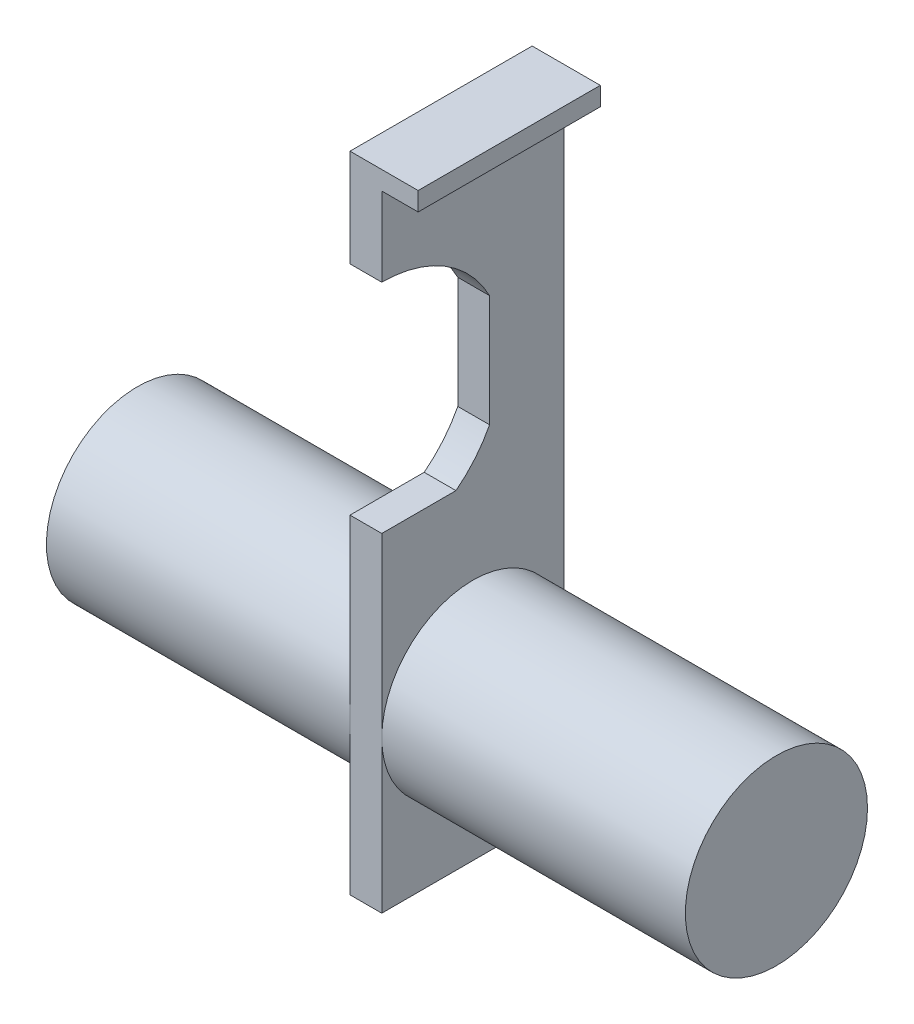
ISO-10303-21;
HEADER;
FILE_DESCRIPTION(('STEP AP214'),'2;1');
FILE_NAME('part.step','',(''),(''),'','','');
FILE_SCHEMA(('AUTOMOTIVE_DESIGN { 1 0 10303 214 1 1 1 1 }'));
ENDSEC;
DATA;
#1=APPLICATION_CONTEXT('core data for automotive mechanical design processes');
#2=APPLICATION_PROTOCOL_DEFINITION('international standard','automotive_design',2000,#1);
#3=PRODUCT_CONTEXT('',#1,'mechanical');
#4=PRODUCT('Part','Part','',(#3));
#5=PRODUCT_RELATED_PRODUCT_CATEGORY('part','',(#4));
#6=PRODUCT_DEFINITION_FORMATION('','',#4);
#7=PRODUCT_DEFINITION_CONTEXT('part definition',#1,'design');
#8=PRODUCT_DEFINITION('design','',#6,#7);
#9=PRODUCT_DEFINITION_SHAPE('','',#8);
#10=(LENGTH_UNIT() NAMED_UNIT(*) SI_UNIT(.MILLI.,.METRE.));
#11=(NAMED_UNIT(*) PLANE_ANGLE_UNIT() SI_UNIT($,.RADIAN.));
#12=(NAMED_UNIT(*) SI_UNIT($,.STERADIAN.) SOLID_ANGLE_UNIT());
#13=UNCERTAINTY_MEASURE_WITH_UNIT(LENGTH_MEASURE(1.E-05),#10,'distance_accuracy_value','');
#14=(GEOMETRIC_REPRESENTATION_CONTEXT(3) GLOBAL_UNCERTAINTY_ASSIGNED_CONTEXT((#13)) GLOBAL_UNIT_ASSIGNED_CONTEXT((#10,
#11,#12)) REPRESENTATION_CONTEXT('',''));
#15=CARTESIAN_POINT('',(0.,0.,0.));
#16=DIRECTION('',(0.,0.,1.));
#17=DIRECTION('',(1.,0.,0.));
#18=AXIS2_PLACEMENT_3D('',#15,#16,#17);
#19=CARTESIAN_POINT('',(0.,-2.59150528660837,7.62));
#20=DIRECTION('',(1.,0.,0.));
#21=DIRECTION('',(0.,1.,0.));
#22=AXIS2_PLACEMENT_3D('',#19,#20,#21);
#23=PLANE('',#22);
#24=CARTESIAN_POINT('',(0.,-19.1015052866084,3.81));
#25=DIRECTION('',(-1.,0.,0.));
#26=DIRECTION('',(0.,-1.,0.));
#27=AXIS2_PLACEMENT_3D('',#24,#25,#26);
#28=CIRCLE('',#27,3.81);
#29=CARTESIAN_POINT('',(0.,-19.1015052866084,7.62));
#30=VERTEX_POINT('',#29);
#31=CARTESIAN_POINT('',(0.,-19.1015052866084,0.));
#32=VERTEX_POINT('',#31);
#33=EDGE_CURVE('E50',#30,#32,#28,.T.);
#34=ORIENTED_EDGE('',*,*,#33,.F.);
#35=DIRECTION('',(0.,-1.,0.));
#36=VECTOR('',#35,1.);
#37=CARTESIAN_POINT('',(0.,1.49263776173654,7.62));
#38=LINE('',#37,#36);
#39=CARTESIAN_POINT('',(0.,-11.6930209069824,7.62));
#40=VERTEX_POINT('',#39);
#41=EDGE_CURVE('E137',#40,#30,#38,.T.);
#42=ORIENTED_EDGE('',*,*,#41,.F.);
#43=DIRECTION('',(0.,0.,-1.));
#44=VECTOR('',#43,1.);
#45=CARTESIAN_POINT('',(0.,-11.6930209069824,7.62));
#46=LINE('',#45,#44);
#47=CARTESIAN_POINT('',(0.,-11.6930209069824,4.51616171247803));
#48=VERTEX_POINT('',#47);
#49=EDGE_CURVE('E284',#40,#48,#46,.T.);
#50=ORIENTED_EDGE('',*,*,#49,.T.);
#51=CARTESIAN_POINT('',(0.,-7.67150528660837,7.62));
#52=DIRECTION('',(1.,0.,0.));
#53=DIRECTION('',(0.,1.,0.));
#54=AXIS2_PLACEMENT_3D('',#51,#52,#53);
#55=CIRCLE('',#54,5.08);
#56=CARTESIAN_POINT('',(0.,-10.0108692751987,3.11070114886065));
#57=VERTEX_POINT('',#56);
#58=EDGE_CURVE('E256',#48,#57,#55,.T.);
#59=ORIENTED_EDGE('',*,*,#58,.T.);
#60=DIRECTION('',(0.,1.,0.));
#61=VECTOR('',#60,1.);
#62=CARTESIAN_POINT('',(0.,-2.59150528660837,3.11070114886065));
#63=LINE('',#62,#61);
#64=CARTESIAN_POINT('',(0.,-5.33214129801802,3.11070114886065));
#65=VERTEX_POINT('',#64);
#66=EDGE_CURVE('E43',#57,#65,#63,.T.);
#67=ORIENTED_EDGE('',*,*,#66,.T.);
#68=CARTESIAN_POINT('',(0.,-7.67150528660837,7.62));
#69=DIRECTION('',(1.,0.,0.));
#70=DIRECTION('',(0.,1.,0.));
#71=AXIS2_PLACEMENT_3D('',#68,#69,#70);
#72=CIRCLE('',#71,5.08);
#73=CARTESIAN_POINT('',(0.,-2.59150528660837,7.62));
#74=VERTEX_POINT('',#73);
#75=EDGE_CURVE('E263',#65,#74,#72,.T.);
#76=ORIENTED_EDGE('',*,*,#75,.T.);
#77=CARTESIAN_POINT('',(0.,1.49263776173654,7.62));
#78=VERTEX_POINT('',#77);
#79=EDGE_CURVE('E148',#78,#74,#38,.T.);
#80=ORIENTED_EDGE('',*,*,#79,.F.);
#81=DIRECTION('',(0.,0.,-1.));
#82=VECTOR('',#81,1.);
#83=CARTESIAN_POINT('',(0.,1.49263776173654,7.62));
#84=LINE('',#83,#82);
#85=CARTESIAN_POINT('',(0.,1.49263776173654,0.));
#86=VERTEX_POINT('',#85);
#87=EDGE_CURVE('E245',#78,#86,#84,.T.);
#88=ORIENTED_EDGE('',*,*,#87,.T.);
#89=DIRECTION('',(0.,-1.,0.));
#90=VECTOR('',#89,1.);
#91=CARTESIAN_POINT('',(0.,-2.59150528660837,0.));
#92=LINE('',#91,#90);
#93=EDGE_CURVE('E159',#86,#32,#92,.T.);
#94=ORIENTED_EDGE('',*,*,#93,.T.);
#95=EDGE_LOOP('',(#34,#42,#50,#59,#67,#76,#80,#88,#94));
#96=FACE_BOUND('',#95,.T.);
#97=ADVANCED_FACE('F39',(#96),#23,.F.);
#98=CARTESIAN_POINT('',(1.32900114555892,-2.59150528660837,7.62));
#99=DIRECTION('',(-1.,0.,0.));
#100=DIRECTION('',(0.,0.,1.));
#101=AXIS2_PLACEMENT_3D('',#98,#99,#100);
#102=PLANE('',#101);
#103=CARTESIAN_POINT('',(1.32900114555892,-19.1015052866084,3.81));
#104=DIRECTION('',(1.,0.,0.));
#105=DIRECTION('',(0.,0.,-1.));
#106=AXIS2_PLACEMENT_3D('',#103,#104,#105);
#107=CIRCLE('',#106,3.81);
#108=CARTESIAN_POINT('',(1.32900114555892,-19.1015052866084,7.62));
#109=VERTEX_POINT('',#108);
#110=CARTESIAN_POINT('',(1.32900114555892,-19.1015052866084,0.));
#111=VERTEX_POINT('',#110);
#112=EDGE_CURVE('E376',#109,#111,#107,.T.);
#113=ORIENTED_EDGE('',*,*,#112,.F.);
#114=DIRECTION('',(0.,1.,0.));
#115=VECTOR('',#114,1.);
#116=CARTESIAN_POINT('',(1.32900114555892,-12.7515052866084,7.62));
#117=LINE('',#116,#115);
#118=CARTESIAN_POINT('',(1.32900114555892,-25.4515052866084,7.62));
#119=VERTEX_POINT('',#118);
#120=EDGE_CURVE('E295',#119,#109,#117,.T.);
#121=ORIENTED_EDGE('',*,*,#120,.F.);
#122=DIRECTION('',(0.,0.,1.));
#123=VECTOR('',#122,1.);
#124=CARTESIAN_POINT('',(1.32900114555892,-25.4515052866084,0.));
#125=LINE('',#124,#123);
#126=CARTESIAN_POINT('',(1.32900114555892,-25.4515052866084,0.));
#127=VERTEX_POINT('',#126);
#128=EDGE_CURVE('E319',#127,#119,#125,.T.);
#129=ORIENTED_EDGE('',*,*,#128,.F.);
#130=DIRECTION('',(0.,1.,0.));
#131=VECTOR('',#130,1.);
#132=CARTESIAN_POINT('',(1.32900114555892,-2.59150528660837,0.));
#133=LINE('',#132,#131);
#134=EDGE_CURVE('E225',#127,#111,#133,.T.);
#135=ORIENTED_EDGE('',*,*,#134,.T.);
#136=EDGE_LOOP('',(#113,#121,#129,#135));
#137=FACE_BOUND('',#136,.T.);
#138=ADVANCED_FACE('F180',(#137),#102,.F.);
#139=CARTESIAN_POINT('',(0.,0.,7.62));
#140=DIRECTION('',(0.,0.,1.));
#141=DIRECTION('',(1.,0.,0.));
#142=AXIS2_PLACEMENT_3D('',#139,#140,#141);
#143=PLANE('',#142);
#144=DIRECTION('',(1.,0.,0.));
#145=VECTOR('',#144,1.);
#146=CARTESIAN_POINT('',(-5.02099885444108,-2.59150528660837,7.62));
#147=LINE('',#146,#145);
#148=CARTESIAN_POINT('',(1.32900114555892,-2.59150528660837,7.62));
#149=VERTEX_POINT('',#148);
#150=EDGE_CURVE('E254',#149,#74,#147,.F.);
#151=ORIENTED_EDGE('',*,*,#150,.F.);
#152=CARTESIAN_POINT('',(1.32900114555892,0.714117771054303,7.62));
#153=VERTEX_POINT('',#152);
#154=EDGE_CURVE('E244',#149,#153,#117,.T.);
#155=ORIENTED_EDGE('',*,*,#154,.T.);
#156=DIRECTION('',(1.,0.,0.));
#157=VECTOR('',#156,1.);
#158=CARTESIAN_POINT('',(2.85065385461965,0.714117771054303,7.62));
#159=LINE('',#158,#157);
#160=CARTESIAN_POINT('',(2.85065385461965,0.714117771054303,7.62));
#161=VERTEX_POINT('',#160);
#162=EDGE_CURVE('E298',#153,#161,#159,.T.);
#163=ORIENTED_EDGE('',*,*,#162,.T.);
#164=DIRECTION('',(0.,1.,0.));
#165=VECTOR('',#164,1.);
#166=CARTESIAN_POINT('',(2.85065385461965,1.49263776173654,7.62));
#167=LINE('',#166,#165);
#168=CARTESIAN_POINT('',(2.85065385461965,1.49263776173654,7.62));
#169=VERTEX_POINT('',#168);
#170=EDGE_CURVE('E230',#161,#169,#167,.T.);
#171=ORIENTED_EDGE('',*,*,#170,.T.);
#172=DIRECTION('',(-1.,0.,0.));
#173=VECTOR('',#172,1.);
#174=CARTESIAN_POINT('',(1.32900114555892,1.49263776173654,7.62));
#175=LINE('',#174,#173);
#176=EDGE_CURVE('E155',#169,#78,#175,.T.);
#177=ORIENTED_EDGE('',*,*,#176,.T.);
#178=ORIENTED_EDGE('',*,*,#79,.T.);
#179=EDGE_LOOP('',(#151,#155,#163,#171,#177,#178));
#180=FACE_BOUND('',#179,.T.);
#181=ADVANCED_FACE('F185',(#180),#143,.T.);
#182=EDGE_CURVE('E63',#111,#109,#107,.T.);
#183=ORIENTED_EDGE('',*,*,#182,.F.);
#184=CARTESIAN_POINT('',(1.32900114555892,0.714117771054303,0.));
#185=VERTEX_POINT('',#184);
#186=EDGE_CURVE('E294',#111,#185,#133,.T.);
#187=ORIENTED_EDGE('',*,*,#186,.T.);
#188=DIRECTION('',(0.,0.,-1.));
#189=VECTOR('',#188,1.);
#190=CARTESIAN_POINT('',(1.32900114555892,0.714117771054303,7.62));
#191=LINE('',#190,#189);
#192=EDGE_CURVE('E220',#153,#185,#191,.T.);
#193=ORIENTED_EDGE('',*,*,#192,.F.);
#194=ORIENTED_EDGE('',*,*,#154,.F.);
#195=CARTESIAN_POINT('',(1.32900114555892,-7.67150528660837,7.62));
#196=DIRECTION('',(1.,0.,0.));
#197=DIRECTION('',(0.,0.,-1.));
#198=AXIS2_PLACEMENT_3D('',#195,#196,#197);
#199=CIRCLE('',#198,5.08);
#200=CARTESIAN_POINT('',(1.32900114555892,-5.33214129801802,3.11070114886065));
#201=VERTEX_POINT('',#200);
#202=EDGE_CURVE('E326',#201,#149,#199,.T.);
#203=ORIENTED_EDGE('',*,*,#202,.F.);
#204=DIRECTION('',(0.,1.,0.));
#205=VECTOR('',#204,1.);
#206=CARTESIAN_POINT('',(1.32900114555892,-5.33214129801802,3.11070114886065));
#207=LINE('',#206,#205);
#208=CARTESIAN_POINT('',(1.32900114555892,-10.0108692751987,3.11070114886065));
#209=VERTEX_POINT('',#208);
#210=EDGE_CURVE('E286',#209,#201,#207,.T.);
#211=ORIENTED_EDGE('',*,*,#210,.F.);
#212=CARTESIAN_POINT('',(1.32900114555892,-7.67150528660837,7.62));
#213=DIRECTION('',(1.,0.,0.));
#214=DIRECTION('',(0.,0.,-1.));
#215=AXIS2_PLACEMENT_3D('',#212,#213,#214);
#216=CIRCLE('',#215,5.08);
#217=CARTESIAN_POINT('',(1.32900114555892,-11.6930209069824,4.51616171247803));
#218=VERTEX_POINT('',#217);
#219=EDGE_CURVE('E277',#218,#209,#216,.T.);
#220=ORIENTED_EDGE('',*,*,#219,.F.);
#221=DIRECTION('',(0.,0.,-1.));
#222=VECTOR('',#221,1.);
#223=CARTESIAN_POINT('',(1.32900114555892,-11.6930209069824,7.62));
#224=LINE('',#223,#222);
#225=CARTESIAN_POINT('',(1.32900114555892,-11.6930209069824,7.62));
#226=VERTEX_POINT('',#225);
#227=EDGE_CURVE('E332',#226,#218,#224,.T.);
#228=ORIENTED_EDGE('',*,*,#227,.F.);
#229=EDGE_CURVE('E299',#109,#226,#117,.T.);
#230=ORIENTED_EDGE('',*,*,#229,.F.);
#231=EDGE_LOOP('',(#183,#187,#193,#194,#203,#211,#220,#228,#230));
#232=FACE_BOUND('',#231,.T.);
#233=ADVANCED_FACE('F41',(#232),#102,.F.);
#234=CARTESIAN_POINT('',(2.85065385461965,0.714117771054303,7.62));
#235=DIRECTION('',(0.,1.,0.));
#236=DIRECTION('',(-1.,0.,0.));
#237=AXIS2_PLACEMENT_3D('',#234,#235,#236);
#238=PLANE('',#237);
#239=DIRECTION('',(1.,0.,0.));
#240=VECTOR('',#239,1.);
#241=CARTESIAN_POINT('',(2.85065385461965,0.714117771054303,0.));
#242=LINE('',#241,#240);
#243=CARTESIAN_POINT('',(2.85065385461965,0.714117771054303,0.));
#244=VERTEX_POINT('',#243);
#245=EDGE_CURVE('E214',#185,#244,#242,.T.);
#246=ORIENTED_EDGE('',*,*,#245,.T.);
#247=DIRECTION('',(0.,0.,-1.));
#248=VECTOR('',#247,1.);
#249=CARTESIAN_POINT('',(2.85065385461965,0.714117771054303,7.62));
#250=LINE('',#249,#248);
#251=EDGE_CURVE('E217',#161,#244,#250,.T.);
#252=ORIENTED_EDGE('',*,*,#251,.F.);
#253=ORIENTED_EDGE('',*,*,#162,.F.);
#254=ORIENTED_EDGE('',*,*,#192,.T.);
#255=EDGE_LOOP('',(#246,#252,#253,#254));
#256=FACE_BOUND('',#255,.T.);
#257=ADVANCED_FACE('F202',(#256),#238,.F.);
#258=CARTESIAN_POINT('',(2.85065385461965,1.49263776173654,7.62));
#259=DIRECTION('',(-1.,0.,0.));
#260=DIRECTION('',(0.,0.,1.));
#261=AXIS2_PLACEMENT_3D('',#258,#259,#260);
#262=PLANE('',#261);
#263=DIRECTION('',(0.,1.,0.));
#264=VECTOR('',#263,1.);
#265=CARTESIAN_POINT('',(2.85065385461965,1.49263776173654,0.));
#266=LINE('',#265,#264);
#267=CARTESIAN_POINT('',(2.85065385461965,1.49263776173654,0.));
#268=VERTEX_POINT('',#267);
#269=EDGE_CURVE('E224',#244,#268,#266,.T.);
#270=ORIENTED_EDGE('',*,*,#269,.T.);
#271=DIRECTION('',(0.,0.,-1.));
#272=VECTOR('',#271,1.);
#273=CARTESIAN_POINT('',(2.85065385461965,1.49263776173654,7.62));
#274=LINE('',#273,#272);
#275=EDGE_CURVE('E232',#169,#268,#274,.T.);
#276=ORIENTED_EDGE('',*,*,#275,.F.);
#277=ORIENTED_EDGE('',*,*,#170,.F.);
#278=ORIENTED_EDGE('',*,*,#251,.T.);
#279=EDGE_LOOP('',(#270,#276,#277,#278));
#280=FACE_BOUND('',#279,.T.);
#281=ADVANCED_FACE('F197',(#280),#262,.F.);
#282=CARTESIAN_POINT('',(1.32900114555892,1.49263776173654,7.62));
#283=DIRECTION('',(0.,-1.,0.));
#284=DIRECTION('',(0.,0.,-1.));
#285=AXIS2_PLACEMENT_3D('',#282,#283,#284);
#286=PLANE('',#285);
#287=DIRECTION('',(-1.,0.,0.));
#288=VECTOR('',#287,1.);
#289=CARTESIAN_POINT('',(1.32900114555892,1.49263776173654,0.));
#290=LINE('',#289,#288);
#291=EDGE_CURVE('E234',#268,#86,#290,.T.);
#292=ORIENTED_EDGE('',*,*,#291,.T.);
#293=ORIENTED_EDGE('',*,*,#87,.F.);
#294=ORIENTED_EDGE('',*,*,#176,.F.);
#295=ORIENTED_EDGE('',*,*,#275,.T.);
#296=EDGE_LOOP('',(#292,#293,#294,#295));
#297=FACE_BOUND('',#296,.T.);
#298=ADVANCED_FACE('F190',(#297),#286,.F.);
#299=EDGE_CURVE('E11',#32,#30,#28,.T.);
#300=ORIENTED_EDGE('',*,*,#299,.F.);
#301=CARTESIAN_POINT('',(0.,-25.4515052866084,0.));
#302=VERTEX_POINT('',#301);
#303=EDGE_CURVE('E238',#32,#302,#92,.T.);
#304=ORIENTED_EDGE('',*,*,#303,.T.);
#305=DIRECTION('',(0.,0.,-1.));
#306=VECTOR('',#305,1.);
#307=CARTESIAN_POINT('',(0.,-25.4515052866084,7.62));
#308=LINE('',#307,#306);
#309=CARTESIAN_POINT('',(0.,-25.4515052866084,7.62));
#310=VERTEX_POINT('',#309);
#311=EDGE_CURVE('E153',#310,#302,#308,.T.);
#312=ORIENTED_EDGE('',*,*,#311,.F.);
#313=EDGE_CURVE('E140',#30,#310,#38,.T.);
#314=ORIENTED_EDGE('',*,*,#313,.F.);
#315=EDGE_LOOP('',(#300,#304,#312,#314));
#316=FACE_BOUND('',#315,.T.);
#317=ADVANCED_FACE('F151',(#316),#23,.F.);
#318=DIRECTION('',(1.,0.,0.));
#319=VECTOR('',#318,1.);
#320=CARTESIAN_POINT('',(0.,-11.6930209069824,7.62));
#321=LINE('',#320,#319);
#322=EDGE_CURVE('E143',#40,#226,#321,.T.);
#323=ORIENTED_EDGE('',*,*,#322,.F.);
#324=ORIENTED_EDGE('',*,*,#41,.T.);
#325=ORIENTED_EDGE('',*,*,#313,.T.);
#326=DIRECTION('',(-1.,0.,0.));
#327=VECTOR('',#326,1.);
#328=CARTESIAN_POINT('',(1.32900114555892,-25.4515052866084,7.62));
#329=LINE('',#328,#327);
#330=EDGE_CURVE('E323',#119,#310,#329,.T.);
#331=ORIENTED_EDGE('',*,*,#330,.F.);
#332=ORIENTED_EDGE('',*,*,#120,.T.);
#333=ORIENTED_EDGE('',*,*,#229,.T.);
#334=EDGE_LOOP('',(#323,#324,#325,#331,#332,#333));
#335=FACE_BOUND('',#334,.T.);
#336=ADVANCED_FACE('F138',(#335),#143,.T.);
#337=CARTESIAN_POINT('',(0.,0.,0.));
#338=DIRECTION('',(0.,0.,1.));
#339=DIRECTION('',(1.,0.,0.));
#340=AXIS2_PLACEMENT_3D('',#337,#338,#339);
#341=PLANE('',#340);
#342=ORIENTED_EDGE('',*,*,#134,.F.);
#343=DIRECTION('',(1.,0.,0.));
#344=VECTOR('',#343,1.);
#345=CARTESIAN_POINT('',(0.,-25.4515052866084,0.));
#346=LINE('',#345,#344);
#347=EDGE_CURVE('E315',#302,#127,#346,.T.);
#348=ORIENTED_EDGE('',*,*,#347,.F.);
#349=ORIENTED_EDGE('',*,*,#303,.F.);
#350=ORIENTED_EDGE('',*,*,#93,.F.);
#351=ORIENTED_EDGE('',*,*,#291,.F.);
#352=ORIENTED_EDGE('',*,*,#269,.F.);
#353=ORIENTED_EDGE('',*,*,#245,.F.);
#354=ORIENTED_EDGE('',*,*,#186,.F.);
#355=EDGE_LOOP('',(#342,#348,#349,#350,#351,#352,#353,#354));
#356=FACE_BOUND('',#355,.T.);
#357=ADVANCED_FACE('F195',(#356),#341,.F.);
#358=CARTESIAN_POINT('',(-5.02099885444108,-5.33214129801802,3.11070114886065));
#359=DIRECTION('',(0.,0.,-1.));
#360=DIRECTION('',(0.,1.,0.));
#361=AXIS2_PLACEMENT_3D('',#358,#359,#360);
#362=PLANE('',#361);
#363=DIRECTION('',(1.,0.,0.));
#364=VECTOR('',#363,1.);
#365=CARTESIAN_POINT('',(-5.02099885444108,-10.0108692751987,3.11070114886065));
#366=LINE('',#365,#364);
#367=EDGE_CURVE('E270',#57,#209,#366,.T.);
#368=ORIENTED_EDGE('',*,*,#367,.T.);
#369=ORIENTED_EDGE('',*,*,#210,.T.);
#370=DIRECTION('',(1.,0.,0.));
#371=VECTOR('',#370,1.);
#372=CARTESIAN_POINT('',(-5.02099885444108,-5.33214129801802,3.11070114886065));
#373=LINE('',#372,#371);
#374=EDGE_CURVE('E272',#65,#201,#373,.T.);
#375=ORIENTED_EDGE('',*,*,#374,.F.);
#376=ORIENTED_EDGE('',*,*,#66,.F.);
#377=EDGE_LOOP('',(#368,#369,#375,#376));
#378=FACE_BOUND('',#377,.T.);
#379=ADVANCED_FACE('F268',(#378),#362,.F.);
#380=CARTESIAN_POINT('',(-5.02099885444108,-7.67150528660837,7.62));
#381=DIRECTION('',(1.,0.,0.));
#382=DIRECTION('',(0.,0.,-1.));
#383=AXIS2_PLACEMENT_3D('',#380,#381,#382);
#384=CYLINDRICAL_SURFACE('',#383,5.08);
#385=DIRECTION('',(1.,0.,0.));
#386=VECTOR('',#385,1.);
#387=CARTESIAN_POINT('',(-5.02099885444108,-11.6930209069824,4.51616171247803));
#388=LINE('',#387,#386);
#389=EDGE_CURVE('E280',#48,#218,#388,.T.);
#390=ORIENTED_EDGE('',*,*,#389,.T.);
#391=ORIENTED_EDGE('',*,*,#219,.T.);
#392=ORIENTED_EDGE('',*,*,#367,.F.);
#393=ORIENTED_EDGE('',*,*,#58,.F.);
#394=EDGE_LOOP('',(#390,#391,#392,#393));
#395=FACE_BOUND('',#394,.T.);
#396=ADVANCED_FACE('F274',(#395),#384,.F.);
#397=CARTESIAN_POINT('',(-5.02099885444108,-7.67150528660837,7.62));
#398=DIRECTION('',(1.,0.,0.));
#399=DIRECTION('',(0.,0.,-1.));
#400=AXIS2_PLACEMENT_3D('',#397,#398,#399);
#401=CYLINDRICAL_SURFACE('',#400,5.08);
#402=ORIENTED_EDGE('',*,*,#374,.T.);
#403=ORIENTED_EDGE('',*,*,#202,.T.);
#404=ORIENTED_EDGE('',*,*,#150,.T.);
#405=ORIENTED_EDGE('',*,*,#75,.F.);
#406=EDGE_LOOP('',(#402,#403,#404,#405));
#407=FACE_BOUND('',#406,.T.);
#408=ADVANCED_FACE('F341',(#407),#401,.F.);
#409=CARTESIAN_POINT('',(-5.02099885444108,-11.6930209069824,7.62));
#410=DIRECTION('',(0.,-1.,0.));
#411=DIRECTION('',(0.,0.,-1.));
#412=AXIS2_PLACEMENT_3D('',#409,#410,#411);
#413=PLANE('',#412);
#414=ORIENTED_EDGE('',*,*,#322,.T.);
#415=ORIENTED_EDGE('',*,*,#227,.T.);
#416=ORIENTED_EDGE('',*,*,#389,.F.);
#417=ORIENTED_EDGE('',*,*,#49,.F.);
#418=EDGE_LOOP('',(#414,#415,#416,#417));
#419=FACE_BOUND('',#418,.T.);
#420=ADVANCED_FACE('F349',(#419),#413,.F.);
#421=CARTESIAN_POINT('',(0.,-25.4515052866084,0.));
#422=DIRECTION('',(0.,-1.,0.));
#423=DIRECTION('',(0.,0.,-1.));
#424=AXIS2_PLACEMENT_3D('',#421,#422,#423);
#425=PLANE('',#424);
#426=ORIENTED_EDGE('',*,*,#311,.T.);
#427=ORIENTED_EDGE('',*,*,#347,.T.);
#428=ORIENTED_EDGE('',*,*,#128,.T.);
#429=ORIENTED_EDGE('',*,*,#330,.T.);
#430=EDGE_LOOP('',(#426,#427,#428,#429));
#431=FACE_BOUND('',#430,.T.);
#432=ADVANCED_FACE('F318',(#431),#425,.T.);
#433=CARTESIAN_POINT('',(14.0290011455589,-19.1015052866084,3.81));
#434=DIRECTION('',(-1.,0.,0.));
#435=DIRECTION('',(0.,0.,1.));
#436=AXIS2_PLACEMENT_3D('',#433,#434,#435);
#437=CYLINDRICAL_SURFACE('',#436,3.81);
#438=CARTESIAN_POINT('',(14.0290011455589,-19.1015052866084,3.81));
#439=DIRECTION('',(1.,0.,0.));
#440=DIRECTION('',(0.,0.,-1.));
#441=AXIS2_PLACEMENT_3D('',#438,#439,#440);
#442=CIRCLE('',#441,3.81);
#443=CARTESIAN_POINT('',(14.0290011455589,-19.1015052866084,0.));
#444=VERTEX_POINT('',#443);
#445=EDGE_CURVE('E375',#444,#444,#442,.T.);
#446=ORIENTED_EDGE('',*,*,#445,.F.);
#447=EDGE_LOOP('',(#446));
#448=FACE_BOUND('',#447,.T.);
#449=ORIENTED_EDGE('',*,*,#182,.T.);
#450=ORIENTED_EDGE('',*,*,#112,.T.);
#451=EDGE_LOOP('',(#449,#450));
#452=FACE_BOUND('',#451,.T.);
#453=ADVANCED_FACE('F175',(#448,#452),#437,.T.);
#454=CARTESIAN_POINT('',(14.0290011455589,-19.1015052866084,3.81));
#455=DIRECTION('',(1.,0.,0.));
#456=DIRECTION('',(0.,0.,-1.));
#457=AXIS2_PLACEMENT_3D('',#454,#455,#456);
#458=PLANE('',#457);
#459=ORIENTED_EDGE('',*,*,#445,.T.);
#460=EDGE_LOOP('',(#459));
#461=FACE_BOUND('',#460,.T.);
#462=ADVANCED_FACE('F166',(#461),#458,.T.);
#463=CARTESIAN_POINT('',(-12.7,-19.1015052866084,3.81));
#464=DIRECTION('',(1.,0.,0.));
#465=DIRECTION('',(0.,1.,0.));
#466=AXIS2_PLACEMENT_3D('',#463,#464,#465);
#467=CYLINDRICAL_SURFACE('',#466,3.81);
#468=CARTESIAN_POINT('',(-12.7,-19.1015052866084,3.81));
#469=DIRECTION('',(-1.,0.,0.));
#470=DIRECTION('',(0.,-1.,0.));
#471=AXIS2_PLACEMENT_3D('',#468,#469,#470);
#472=CIRCLE('',#471,3.81);
#473=CARTESIAN_POINT('',(-12.7,-22.9115052866084,3.81));
#474=VERTEX_POINT('',#473);
#475=EDGE_CURVE('E162',#474,#474,#472,.T.);
#476=ORIENTED_EDGE('',*,*,#475,.F.);
#477=EDGE_LOOP('',(#476));
#478=FACE_BOUND('',#477,.T.);
#479=ORIENTED_EDGE('',*,*,#33,.T.);
#480=ORIENTED_EDGE('',*,*,#299,.T.);
#481=EDGE_LOOP('',(#479,#480));
#482=FACE_BOUND('',#481,.T.);
#483=ADVANCED_FACE('F163',(#478,#482),#467,.T.);
#484=CARTESIAN_POINT('',(-12.7,-19.1015052866084,3.81));
#485=DIRECTION('',(-1.,0.,0.));
#486=DIRECTION('',(0.,-1.,0.));
#487=AXIS2_PLACEMENT_3D('',#484,#485,#486);
#488=PLANE('',#487);
#489=ORIENTED_EDGE('',*,*,#475,.T.);
#490=EDGE_LOOP('',(#489));
#491=FACE_BOUND('',#490,.T.);
#492=ADVANCED_FACE('F165',(#491),#488,.T.);
#493=CLOSED_SHELL('',(#97,#138,#181,#233,#257,#281,#298,#317,#336,#357,#379,#396,#408,#420,#432,
#453,#462,#483,#492));
#494=MANIFOLD_SOLID_BREP('B2',#493);
#495=ADVANCED_BREP_SHAPE_REPRESENTATION('',(#18,#494),#14);
#496=SHAPE_DEFINITION_REPRESENTATION(#9,#495);
ENDSEC;
END-ISO-10303-21;
